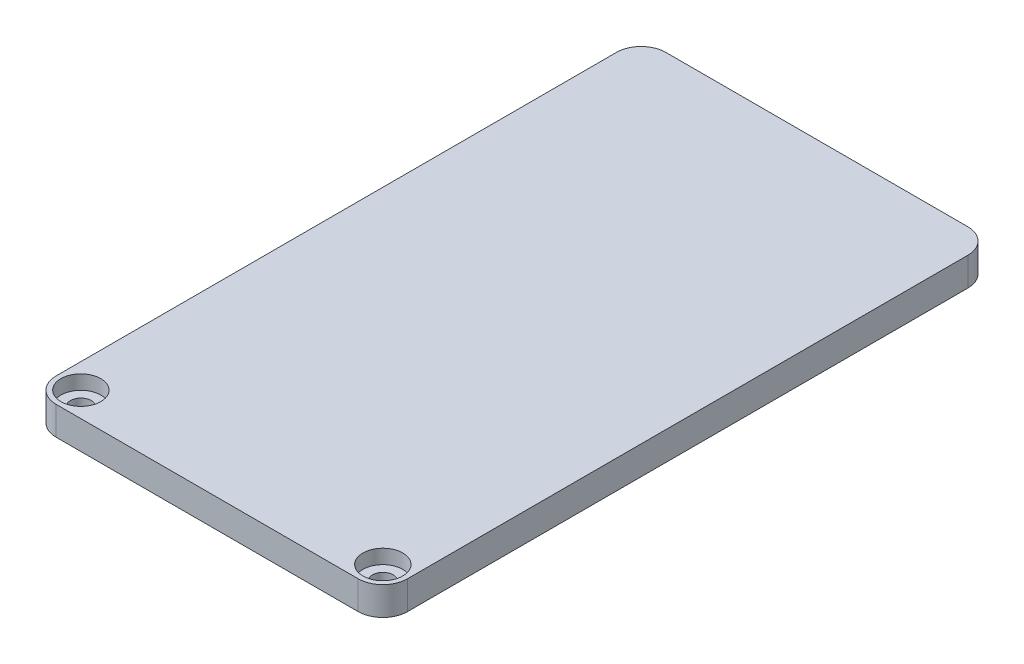
ISO-10303-21;
HEADER;
FILE_DESCRIPTION(('STEP AP214'),'2;1');
FILE_NAME('part.step','',(''),(''),'','','');
FILE_SCHEMA(('AUTOMOTIVE_DESIGN { 1 0 10303 214 1 1 1 1 }'));
ENDSEC;
DATA;
#1=APPLICATION_CONTEXT('core data for automotive mechanical design processes');
#2=APPLICATION_PROTOCOL_DEFINITION('international standard','automotive_design',2000,#1);
#3=PRODUCT_CONTEXT('',#1,'mechanical');
#4=PRODUCT('Part','Part','',(#3));
#5=PRODUCT_RELATED_PRODUCT_CATEGORY('part','',(#4));
#6=PRODUCT_DEFINITION_FORMATION('','',#4);
#7=PRODUCT_DEFINITION_CONTEXT('part definition',#1,'design');
#8=PRODUCT_DEFINITION('design','',#6,#7);
#9=PRODUCT_DEFINITION_SHAPE('','',#8);
#10=(LENGTH_UNIT() NAMED_UNIT(*) SI_UNIT(.MILLI.,.METRE.));
#11=(NAMED_UNIT(*) PLANE_ANGLE_UNIT() SI_UNIT($,.RADIAN.));
#12=(NAMED_UNIT(*) SI_UNIT($,.STERADIAN.) SOLID_ANGLE_UNIT());
#13=UNCERTAINTY_MEASURE_WITH_UNIT(LENGTH_MEASURE(1.E-05),#10,'distance_accuracy_value','');
#14=(GEOMETRIC_REPRESENTATION_CONTEXT(3) GLOBAL_UNCERTAINTY_ASSIGNED_CONTEXT((#13)) GLOBAL_UNIT_ASSIGNED_CONTEXT((#10,
#11,#12)) REPRESENTATION_CONTEXT('',''));
#15=CARTESIAN_POINT('',(0.,0.,0.));
#16=DIRECTION('',(0.,0.,1.));
#17=DIRECTION('',(1.,0.,0.));
#18=AXIS2_PLACEMENT_3D('',#15,#16,#17);
#19=CARTESIAN_POINT('',(-15.9,0.,29.5));
#20=DIRECTION('',(0.,1.,0.));
#21=DIRECTION('',(0.,0.,1.));
#22=AXIS2_PLACEMENT_3D('',#19,#20,#21);
#23=CYLINDRICAL_SURFACE('',#22,1.1);
#24=CARTESIAN_POINT('',(-15.9,0.,29.5));
#25=DIRECTION('',(0.,1.,0.));
#26=DIRECTION('',(0.,0.,1.));
#27=AXIS2_PLACEMENT_3D('',#24,#25,#26);
#28=CIRCLE('',#27,1.1);
#29=CARTESIAN_POINT('',(-15.9,0.,30.6));
#30=VERTEX_POINT('',#29);
#31=EDGE_CURVE('E164',#30,#30,#28,.T.);
#32=ORIENTED_EDGE('',*,*,#31,.F.);
#33=EDGE_LOOP('',(#32));
#34=FACE_BOUND('',#33,.T.);
#35=CARTESIAN_POINT('',(-15.9,1.5,29.5));
#36=DIRECTION('',(0.,1.,0.));
#37=DIRECTION('',(0.,0.,1.));
#38=AXIS2_PLACEMENT_3D('',#35,#36,#37);
#39=CIRCLE('',#38,1.1);
#40=CARTESIAN_POINT('',(-15.9,1.5,30.6));
#41=VERTEX_POINT('',#40);
#42=EDGE_CURVE('E39',#41,#41,#39,.F.);
#43=ORIENTED_EDGE('',*,*,#42,.F.);
#44=EDGE_LOOP('',(#43));
#45=FACE_BOUND('',#44,.T.);
#46=ADVANCED_FACE('F35',(#34,#45),#23,.F.);
#47=CARTESIAN_POINT('',(15.9,0.,29.5));
#48=DIRECTION('',(0.,1.,0.));
#49=DIRECTION('',(0.,0.,1.));
#50=AXIS2_PLACEMENT_3D('',#47,#48,#49);
#51=CYLINDRICAL_SURFACE('',#50,1.1);
#52=CARTESIAN_POINT('',(15.9,0.,29.5));
#53=DIRECTION('',(0.,1.,0.));
#54=DIRECTION('',(0.,0.,1.));
#55=AXIS2_PLACEMENT_3D('',#52,#53,#54);
#56=CIRCLE('',#55,1.1);
#57=CARTESIAN_POINT('',(15.9,0.,30.6));
#58=VERTEX_POINT('',#57);
#59=EDGE_CURVE('E179',#58,#58,#56,.T.);
#60=ORIENTED_EDGE('',*,*,#59,.F.);
#61=EDGE_LOOP('',(#60));
#62=FACE_BOUND('',#61,.T.);
#63=CARTESIAN_POINT('',(15.9,1.5,29.5));
#64=DIRECTION('',(0.,1.,0.));
#65=DIRECTION('',(0.,0.,1.));
#66=AXIS2_PLACEMENT_3D('',#63,#64,#65);
#67=CIRCLE('',#66,1.1);
#68=CARTESIAN_POINT('',(15.9,1.5,30.6));
#69=VERTEX_POINT('',#68);
#70=EDGE_CURVE('E158',#69,#69,#67,.F.);
#71=ORIENTED_EDGE('',*,*,#70,.F.);
#72=EDGE_LOOP('',(#71));
#73=FACE_BOUND('',#72,.T.);
#74=ADVANCED_FACE('F213',(#62,#73),#51,.F.);
#75=CARTESIAN_POINT('',(18.5,3.,-32.1));
#76=DIRECTION('',(-1.,0.,0.));
#77=DIRECTION('',(0.,0.,1.));
#78=AXIS2_PLACEMENT_3D('',#75,#76,#77);
#79=PLANE('',#78);
#80=DIRECTION('',(0.,0.,-1.));
#81=VECTOR('',#80,1.);
#82=CARTESIAN_POINT('',(18.5,0.,-32.1));
#83=LINE('',#82,#81);
#84=CARTESIAN_POINT('',(18.5,0.,29.5));
#85=VERTEX_POINT('',#84);
#86=CARTESIAN_POINT('',(18.5,0.,-29.5));
#87=VERTEX_POINT('',#86);
#88=EDGE_CURVE('E134',#85,#87,#83,.T.);
#89=ORIENTED_EDGE('',*,*,#88,.T.);
#90=DIRECTION('',(0.,-1.,0.));
#91=VECTOR('',#90,1.);
#92=CARTESIAN_POINT('',(18.5,3.,-29.5));
#93=LINE('',#92,#91);
#94=CARTESIAN_POINT('',(18.5,3.,-29.5));
#95=VERTEX_POINT('',#94);
#96=EDGE_CURVE('E156',#87,#95,#93,.F.);
#97=ORIENTED_EDGE('',*,*,#96,.T.);
#98=DIRECTION('',(0.,0.,-1.));
#99=VECTOR('',#98,1.);
#100=CARTESIAN_POINT('',(18.5,3.,-32.1));
#101=LINE('',#100,#99);
#102=CARTESIAN_POINT('',(18.5,3.,29.5));
#103=VERTEX_POINT('',#102);
#104=EDGE_CURVE('E132',#103,#95,#101,.T.);
#105=ORIENTED_EDGE('',*,*,#104,.F.);
#106=DIRECTION('',(0.,-1.,0.));
#107=VECTOR('',#106,1.);
#108=CARTESIAN_POINT('',(18.5,3.,29.5));
#109=LINE('',#108,#107);
#110=EDGE_CURVE('E153',#103,#85,#109,.T.);
#111=ORIENTED_EDGE('',*,*,#110,.T.);
#112=EDGE_LOOP('',(#89,#97,#105,#111));
#113=FACE_BOUND('',#112,.T.);
#114=ADVANCED_FACE('F194',(#113),#79,.F.);
#115=CARTESIAN_POINT('',(-18.5,3.,-32.1));
#116=DIRECTION('',(0.,0.,1.));
#117=DIRECTION('',(1.,0.,0.));
#118=AXIS2_PLACEMENT_3D('',#115,#116,#117);
#119=PLANE('',#118);
#120=DIRECTION('',(-1.,0.,0.));
#121=VECTOR('',#120,1.);
#122=CARTESIAN_POINT('',(-18.5,0.,-32.1));
#123=LINE('',#122,#121);
#124=CARTESIAN_POINT('',(15.9,0.,-32.1));
#125=VERTEX_POINT('',#124);
#126=CARTESIAN_POINT('',(-15.9,0.,-32.1));
#127=VERTEX_POINT('',#126);
#128=EDGE_CURVE('E130',#125,#127,#123,.T.);
#129=ORIENTED_EDGE('',*,*,#128,.T.);
#130=DIRECTION('',(0.,-1.,0.));
#131=VECTOR('',#130,1.);
#132=CARTESIAN_POINT('',(-15.9,3.,-32.1));
#133=LINE('',#132,#131);
#134=CARTESIAN_POINT('',(-15.9,3.,-32.1));
#135=VERTEX_POINT('',#134);
#136=EDGE_CURVE('E108',#127,#135,#133,.F.);
#137=ORIENTED_EDGE('',*,*,#136,.T.);
#138=DIRECTION('',(-1.,0.,0.));
#139=VECTOR('',#138,1.);
#140=CARTESIAN_POINT('',(-18.5,3.,-32.1));
#141=LINE('',#140,#139);
#142=CARTESIAN_POINT('',(15.9,3.,-32.1));
#143=VERTEX_POINT('',#142);
#144=EDGE_CURVE('E186',#143,#135,#141,.T.);
#145=ORIENTED_EDGE('',*,*,#144,.F.);
#146=DIRECTION('',(0.,-1.,0.));
#147=VECTOR('',#146,1.);
#148=CARTESIAN_POINT('',(15.9,3.,-32.1));
#149=LINE('',#148,#147);
#150=EDGE_CURVE('E113',#143,#125,#149,.T.);
#151=ORIENTED_EDGE('',*,*,#150,.T.);
#152=EDGE_LOOP('',(#129,#137,#145,#151));
#153=FACE_BOUND('',#152,.T.);
#154=ADVANCED_FACE('F204',(#153),#119,.F.);
#155=CARTESIAN_POINT('',(-18.5,3.,-32.1));
#156=DIRECTION('',(1.,0.,0.));
#157=DIRECTION('',(0.,0.,-1.));
#158=AXIS2_PLACEMENT_3D('',#155,#156,#157);
#159=PLANE('',#158);
#160=DIRECTION('',(0.,0.,1.));
#161=VECTOR('',#160,1.);
#162=CARTESIAN_POINT('',(-18.5,3.,-32.1));
#163=LINE('',#162,#161);
#164=CARTESIAN_POINT('',(-18.5,3.,-29.5));
#165=VERTEX_POINT('',#164);
#166=CARTESIAN_POINT('',(-18.5,3.,29.5));
#167=VERTEX_POINT('',#166);
#168=EDGE_CURVE('E122',#165,#167,#163,.T.);
#169=ORIENTED_EDGE('',*,*,#168,.F.);
#170=DIRECTION('',(0.,-1.,0.));
#171=VECTOR('',#170,1.);
#172=CARTESIAN_POINT('',(-18.5,3.,-29.5));
#173=LINE('',#172,#171);
#174=CARTESIAN_POINT('',(-18.5,0.,-29.5));
#175=VERTEX_POINT('',#174);
#176=EDGE_CURVE('E107',#165,#175,#173,.T.);
#177=ORIENTED_EDGE('',*,*,#176,.T.);
#178=DIRECTION('',(0.,0.,1.));
#179=VECTOR('',#178,1.);
#180=CARTESIAN_POINT('',(-18.5,0.,-32.1));
#181=LINE('',#180,#179);
#182=CARTESIAN_POINT('',(-18.5,0.,29.5));
#183=VERTEX_POINT('',#182);
#184=EDGE_CURVE('E120',#175,#183,#181,.T.);
#185=ORIENTED_EDGE('',*,*,#184,.T.);
#186=DIRECTION('',(0.,-1.,0.));
#187=VECTOR('',#186,1.);
#188=CARTESIAN_POINT('',(-18.5,3.,29.5));
#189=LINE('',#188,#187);
#190=EDGE_CURVE('E124',#183,#167,#189,.F.);
#191=ORIENTED_EDGE('',*,*,#190,.T.);
#192=EDGE_LOOP('',(#169,#177,#185,#191));
#193=FACE_BOUND('',#192,.T.);
#194=ADVANCED_FACE('F119',(#193),#159,.F.);
#195=CARTESIAN_POINT('',(-18.5,3.,32.1));
#196=DIRECTION('',(0.,0.,-1.));
#197=DIRECTION('',(-1.,0.,0.));
#198=AXIS2_PLACEMENT_3D('',#195,#196,#197);
#199=PLANE('',#198);
#200=DIRECTION('',(1.,0.,0.));
#201=VECTOR('',#200,1.);
#202=CARTESIAN_POINT('',(-18.5,3.,32.1));
#203=LINE('',#202,#201);
#204=CARTESIAN_POINT('',(-15.9,3.,32.1));
#205=VERTEX_POINT('',#204);
#206=CARTESIAN_POINT('',(15.9,3.,32.1));
#207=VERTEX_POINT('',#206);
#208=EDGE_CURVE('E138',#205,#207,#203,.T.);
#209=ORIENTED_EDGE('',*,*,#208,.F.);
#210=DIRECTION('',(0.,-1.,0.));
#211=VECTOR('',#210,1.);
#212=CARTESIAN_POINT('',(-15.9,3.,32.1));
#213=LINE('',#212,#211);
#214=CARTESIAN_POINT('',(-15.9,0.,32.1));
#215=VERTEX_POINT('',#214);
#216=EDGE_CURVE('E11',#205,#215,#213,.T.);
#217=ORIENTED_EDGE('',*,*,#216,.T.);
#218=DIRECTION('',(1.,0.,0.));
#219=VECTOR('',#218,1.);
#220=CARTESIAN_POINT('',(-18.5,0.,32.1));
#221=LINE('',#220,#219);
#222=CARTESIAN_POINT('',(15.9,0.,32.1));
#223=VERTEX_POINT('',#222);
#224=EDGE_CURVE('E129',#215,#223,#221,.T.);
#225=ORIENTED_EDGE('',*,*,#224,.T.);
#226=DIRECTION('',(0.,-1.,0.));
#227=VECTOR('',#226,1.);
#228=CARTESIAN_POINT('',(15.9,3.,32.1));
#229=LINE('',#228,#227);
#230=EDGE_CURVE('E44',#223,#207,#229,.F.);
#231=ORIENTED_EDGE('',*,*,#230,.T.);
#232=EDGE_LOOP('',(#209,#217,#225,#231));
#233=FACE_BOUND('',#232,.T.);
#234=ADVANCED_FACE('F211',(#233),#199,.F.);
#235=CARTESIAN_POINT('',(0.,3.,0.));
#236=DIRECTION('',(0.,1.,0.));
#237=DIRECTION('',(0.,0.,1.));
#238=AXIS2_PLACEMENT_3D('',#235,#236,#237);
#239=PLANE('',#238);
#240=CARTESIAN_POINT('',(-15.9,3.,29.5));
#241=DIRECTION('',(0.,1.,0.));
#242=DIRECTION('',(0.,0.,1.));
#243=AXIS2_PLACEMENT_3D('',#240,#241,#242);
#244=CIRCLE('',#243,2.1);
#245=CARTESIAN_POINT('',(-15.9,3.,31.6));
#246=VERTEX_POINT('',#245);
#247=EDGE_CURVE('E166',#246,#246,#244,.T.);
#248=ORIENTED_EDGE('',*,*,#247,.F.);
#249=EDGE_LOOP('',(#248));
#250=FACE_BOUND('',#249,.T.);
#251=CARTESIAN_POINT('',(15.9,3.,29.5));
#252=DIRECTION('',(0.,1.,0.));
#253=DIRECTION('',(0.,0.,1.));
#254=AXIS2_PLACEMENT_3D('',#251,#252,#253);
#255=CIRCLE('',#254,2.1);
#256=CARTESIAN_POINT('',(15.9,3.,31.6));
#257=VERTEX_POINT('',#256);
#258=EDGE_CURVE('E176',#257,#257,#255,.T.);
#259=ORIENTED_EDGE('',*,*,#258,.F.);
#260=EDGE_LOOP('',(#259));
#261=FACE_BOUND('',#260,.T.);
#262=ORIENTED_EDGE('',*,*,#144,.T.);
#263=CARTESIAN_POINT('',(-15.9,3.,-29.5));
#264=DIRECTION('',(0.,1.,0.));
#265=DIRECTION('',(0.,0.,1.));
#266=AXIS2_PLACEMENT_3D('',#263,#264,#265);
#267=CIRCLE('',#266,2.6);
#268=EDGE_CURVE('E151',#135,#165,#267,.T.);
#269=ORIENTED_EDGE('',*,*,#268,.T.);
#270=ORIENTED_EDGE('',*,*,#168,.T.);
#271=CARTESIAN_POINT('',(-15.9,3.,29.5));
#272=DIRECTION('',(0.,1.,0.));
#273=DIRECTION('',(0.,0.,1.));
#274=AXIS2_PLACEMENT_3D('',#271,#272,#273);
#275=CIRCLE('',#274,2.6);
#276=EDGE_CURVE('E58',#167,#205,#275,.T.);
#277=ORIENTED_EDGE('',*,*,#276,.T.);
#278=ORIENTED_EDGE('',*,*,#208,.T.);
#279=CARTESIAN_POINT('',(15.9,3.,29.5));
#280=DIRECTION('',(0.,1.,0.));
#281=DIRECTION('',(0.,0.,1.));
#282=AXIS2_PLACEMENT_3D('',#279,#280,#281);
#283=CIRCLE('',#282,2.6);
#284=EDGE_CURVE('E146',#207,#103,#283,.T.);
#285=ORIENTED_EDGE('',*,*,#284,.T.);
#286=ORIENTED_EDGE('',*,*,#104,.T.);
#287=CARTESIAN_POINT('',(15.9,3.,-29.5));
#288=DIRECTION('',(0.,1.,0.));
#289=DIRECTION('',(0.,0.,1.));
#290=AXIS2_PLACEMENT_3D('',#287,#288,#289);
#291=CIRCLE('',#290,2.6);
#292=EDGE_CURVE('E149',#95,#143,#291,.T.);
#293=ORIENTED_EDGE('',*,*,#292,.T.);
#294=EDGE_LOOP('',(#262,#269,#270,#277,#278,#285,#286,#293));
#295=FACE_BOUND('',#294,.T.);
#296=ADVANCED_FACE('F202',(#250,#261,#295),#239,.T.);
#297=CARTESIAN_POINT('',(0.,0.,0.));
#298=DIRECTION('',(0.,1.,0.));
#299=DIRECTION('',(0.,0.,1.));
#300=AXIS2_PLACEMENT_3D('',#297,#298,#299);
#301=PLANE('',#300);
#302=ORIENTED_EDGE('',*,*,#59,.T.);
#303=EDGE_LOOP('',(#302));
#304=FACE_BOUND('',#303,.T.);
#305=ORIENTED_EDGE('',*,*,#31,.T.);
#306=EDGE_LOOP('',(#305));
#307=FACE_BOUND('',#306,.T.);
#308=ORIENTED_EDGE('',*,*,#184,.F.);
#309=CARTESIAN_POINT('',(-15.9,0.,-29.5));
#310=DIRECTION('',(0.,1.,0.));
#311=DIRECTION('',(0.,0.,1.));
#312=AXIS2_PLACEMENT_3D('',#309,#310,#311);
#313=CIRCLE('',#312,2.6);
#314=EDGE_CURVE('E103',#175,#127,#313,.F.);
#315=ORIENTED_EDGE('',*,*,#314,.T.);
#316=ORIENTED_EDGE('',*,*,#128,.F.);
#317=CARTESIAN_POINT('',(15.9,0.,-29.5));
#318=DIRECTION('',(0.,1.,0.));
#319=DIRECTION('',(0.,0.,1.));
#320=AXIS2_PLACEMENT_3D('',#317,#318,#319);
#321=CIRCLE('',#320,2.6);
#322=EDGE_CURVE('E114',#125,#87,#321,.F.);
#323=ORIENTED_EDGE('',*,*,#322,.T.);
#324=ORIENTED_EDGE('',*,*,#88,.F.);
#325=CARTESIAN_POINT('',(15.9,0.,29.5));
#326=DIRECTION('',(0.,1.,0.));
#327=DIRECTION('',(0.,0.,1.));
#328=AXIS2_PLACEMENT_3D('',#325,#326,#327);
#329=CIRCLE('',#328,2.6);
#330=EDGE_CURVE('E123',#85,#223,#329,.F.);
#331=ORIENTED_EDGE('',*,*,#330,.T.);
#332=ORIENTED_EDGE('',*,*,#224,.F.);
#333=CARTESIAN_POINT('',(-15.9,0.,29.5));
#334=DIRECTION('',(0.,1.,0.));
#335=DIRECTION('',(0.,0.,1.));
#336=AXIS2_PLACEMENT_3D('',#333,#334,#335);
#337=CIRCLE('',#336,2.6);
#338=EDGE_CURVE('E128',#215,#183,#337,.F.);
#339=ORIENTED_EDGE('',*,*,#338,.T.);
#340=EDGE_LOOP('',(#308,#315,#316,#323,#324,#331,#332,#339));
#341=FACE_BOUND('',#340,.T.);
#342=ADVANCED_FACE('F126',(#304,#307,#341),#301,.F.);
#343=CARTESIAN_POINT('',(-15.9,3.,-29.5));
#344=DIRECTION('',(0.,-1.,0.));
#345=DIRECTION('',(0.,0.,-1.));
#346=AXIS2_PLACEMENT_3D('',#343,#344,#345);
#347=CYLINDRICAL_SURFACE('',#346,2.6);
#348=ORIENTED_EDGE('',*,*,#268,.F.);
#349=ORIENTED_EDGE('',*,*,#136,.F.);
#350=ORIENTED_EDGE('',*,*,#314,.F.);
#351=ORIENTED_EDGE('',*,*,#176,.F.);
#352=EDGE_LOOP('',(#348,#349,#350,#351));
#353=FACE_BOUND('',#352,.T.);
#354=ADVANCED_FACE('F106',(#353),#347,.T.);
#355=CARTESIAN_POINT('',(15.9,3.,-29.5));
#356=DIRECTION('',(0.,-1.,0.));
#357=DIRECTION('',(0.,0.,-1.));
#358=AXIS2_PLACEMENT_3D('',#355,#356,#357);
#359=CYLINDRICAL_SURFACE('',#358,2.6);
#360=ORIENTED_EDGE('',*,*,#292,.F.);
#361=ORIENTED_EDGE('',*,*,#96,.F.);
#362=ORIENTED_EDGE('',*,*,#322,.F.);
#363=ORIENTED_EDGE('',*,*,#150,.F.);
#364=EDGE_LOOP('',(#360,#361,#362,#363));
#365=FACE_BOUND('',#364,.T.);
#366=ADVANCED_FACE('F199',(#365),#359,.T.);
#367=CARTESIAN_POINT('',(-15.9,3.,29.5));
#368=DIRECTION('',(0.,-1.,0.));
#369=DIRECTION('',(0.,0.,-1.));
#370=AXIS2_PLACEMENT_3D('',#367,#368,#369);
#371=CYLINDRICAL_SURFACE('',#370,2.6);
#372=ORIENTED_EDGE('',*,*,#276,.F.);
#373=ORIENTED_EDGE('',*,*,#190,.F.);
#374=ORIENTED_EDGE('',*,*,#338,.F.);
#375=ORIENTED_EDGE('',*,*,#216,.F.);
#376=EDGE_LOOP('',(#372,#373,#374,#375));
#377=FACE_BOUND('',#376,.T.);
#378=ADVANCED_FACE('F239',(#377),#371,.T.);
#379=CARTESIAN_POINT('',(15.9,3.,29.5));
#380=DIRECTION('',(0.,-1.,0.));
#381=DIRECTION('',(0.,0.,-1.));
#382=AXIS2_PLACEMENT_3D('',#379,#380,#381);
#383=CYLINDRICAL_SURFACE('',#382,2.6);
#384=ORIENTED_EDGE('',*,*,#284,.F.);
#385=ORIENTED_EDGE('',*,*,#230,.F.);
#386=ORIENTED_EDGE('',*,*,#330,.F.);
#387=ORIENTED_EDGE('',*,*,#110,.F.);
#388=EDGE_LOOP('',(#384,#385,#386,#387));
#389=FACE_BOUND('',#388,.T.);
#390=ADVANCED_FACE('F37',(#389),#383,.T.);
#391=CARTESIAN_POINT('',(15.9,1.5,29.5));
#392=DIRECTION('',(0.,1.,0.));
#393=DIRECTION('',(0.,0.,1.));
#394=AXIS2_PLACEMENT_3D('',#391,#392,#393);
#395=PLANE('',#394);
#396=CARTESIAN_POINT('',(15.9,1.5,29.5));
#397=DIRECTION('',(0.,1.,0.));
#398=DIRECTION('',(0.,0.,1.));
#399=AXIS2_PLACEMENT_3D('',#396,#397,#398);
#400=CIRCLE('',#399,2.1);
#401=CARTESIAN_POINT('',(15.9,1.5,31.6));
#402=VERTEX_POINT('',#401);
#403=EDGE_CURVE('E171',#402,#402,#400,.T.);
#404=ORIENTED_EDGE('',*,*,#403,.T.);
#405=EDGE_LOOP('',(#404));
#406=FACE_BOUND('',#405,.T.);
#407=ORIENTED_EDGE('',*,*,#70,.T.);
#408=EDGE_LOOP('',(#407));
#409=FACE_BOUND('',#408,.T.);
#410=ADVANCED_FACE('F245',(#406,#409),#395,.T.);
#411=CARTESIAN_POINT('',(15.9,1.5,29.5));
#412=DIRECTION('',(0.,1.,0.));
#413=DIRECTION('',(0.,0.,1.));
#414=AXIS2_PLACEMENT_3D('',#411,#412,#413);
#415=CYLINDRICAL_SURFACE('',#414,2.1);
#416=ORIENTED_EDGE('',*,*,#403,.F.);
#417=EDGE_LOOP('',(#416));
#418=FACE_BOUND('',#417,.T.);
#419=ORIENTED_EDGE('',*,*,#258,.T.);
#420=EDGE_LOOP('',(#419));
#421=FACE_BOUND('',#420,.T.);
#422=ADVANCED_FACE('F298',(#418,#421),#415,.F.);
#423=CARTESIAN_POINT('',(-15.9,1.5,29.5));
#424=DIRECTION('',(0.,1.,0.));
#425=DIRECTION('',(0.,0.,1.));
#426=AXIS2_PLACEMENT_3D('',#423,#424,#425);
#427=PLANE('',#426);
#428=CARTESIAN_POINT('',(-15.9,1.5,29.5));
#429=DIRECTION('',(0.,1.,0.));
#430=DIRECTION('',(0.,0.,1.));
#431=AXIS2_PLACEMENT_3D('',#428,#429,#430);
#432=CIRCLE('',#431,2.1);
#433=CARTESIAN_POINT('',(-15.9,1.5,31.6));
#434=VERTEX_POINT('',#433);
#435=EDGE_CURVE('E160',#434,#434,#432,.T.);
#436=ORIENTED_EDGE('',*,*,#435,.T.);
#437=EDGE_LOOP('',(#436));
#438=FACE_BOUND('',#437,.T.);
#439=ORIENTED_EDGE('',*,*,#42,.T.);
#440=EDGE_LOOP('',(#439));
#441=FACE_BOUND('',#440,.T.);
#442=ADVANCED_FACE('F308',(#438,#441),#427,.T.);
#443=CARTESIAN_POINT('',(-15.9,1.5,29.5));
#444=DIRECTION('',(0.,1.,0.));
#445=DIRECTION('',(0.,0.,1.));
#446=AXIS2_PLACEMENT_3D('',#443,#444,#445);
#447=CYLINDRICAL_SURFACE('',#446,2.1);
#448=ORIENTED_EDGE('',*,*,#435,.F.);
#449=EDGE_LOOP('',(#448));
#450=FACE_BOUND('',#449,.T.);
#451=ORIENTED_EDGE('',*,*,#247,.T.);
#452=EDGE_LOOP('',(#451));
#453=FACE_BOUND('',#452,.T.);
#454=ADVANCED_FACE('F317',(#450,#453),#447,.F.);
#455=CLOSED_SHELL('',(#46,#74,#114,#154,#194,#234,#296,#342,#354,#366,#378,#390,#410,#422,#442,#454));
#456=MANIFOLD_SOLID_BREP('B2',#455);
#457=ADVANCED_BREP_SHAPE_REPRESENTATION('',(#18,#456),#14);
#458=SHAPE_DEFINITION_REPRESENTATION(#9,#457);
ENDSEC;
END-ISO-10303-21;
